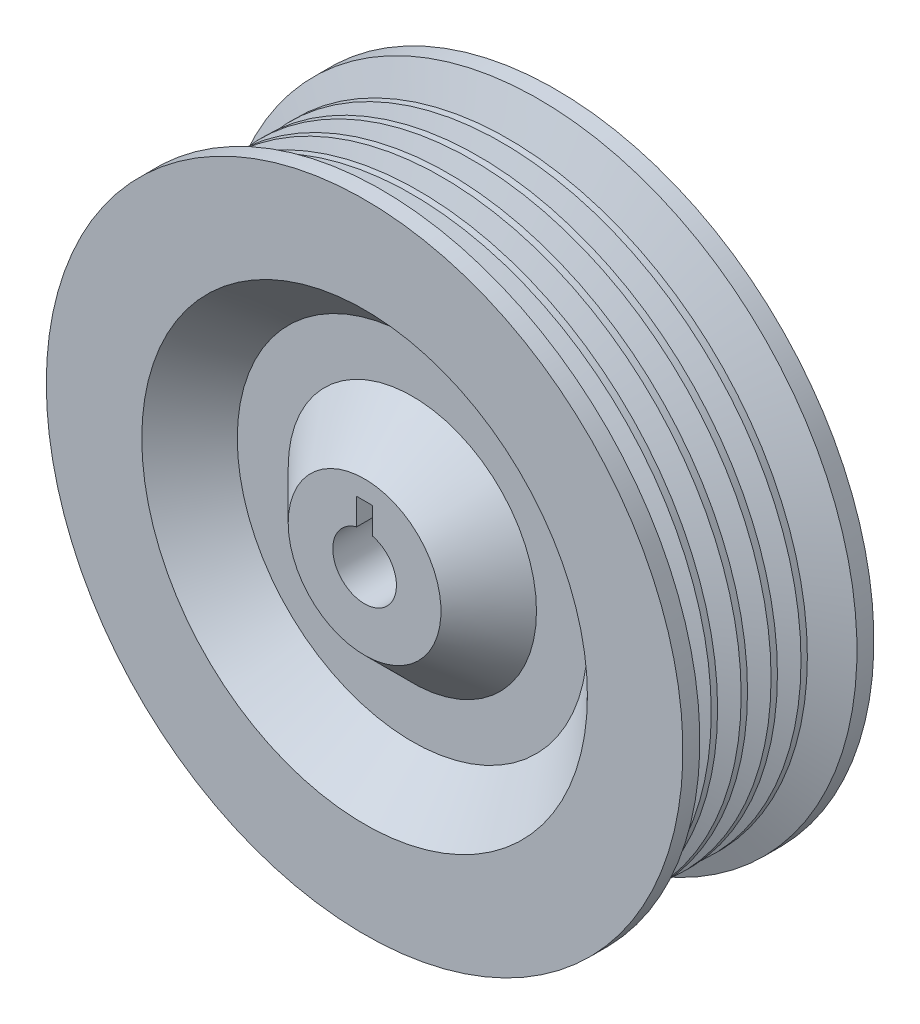
ISO-10303-21;
HEADER;
FILE_DESCRIPTION(('STEP AP214'),'2;1');
FILE_NAME('part.step','',(''),(''),'','','');
FILE_SCHEMA(('AUTOMOTIVE_DESIGN { 1 0 10303 214 1 1 1 1 }'));
ENDSEC;
DATA;
#1=APPLICATION_CONTEXT('core data for automotive mechanical design processes');
#2=APPLICATION_PROTOCOL_DEFINITION('international standard','automotive_design',2000,#1);
#3=PRODUCT_CONTEXT('',#1,'mechanical');
#4=PRODUCT('Part','Part','',(#3));
#5=PRODUCT_RELATED_PRODUCT_CATEGORY('part','',(#4));
#6=PRODUCT_DEFINITION_FORMATION('','',#4);
#7=PRODUCT_DEFINITION_CONTEXT('part definition',#1,'design');
#8=PRODUCT_DEFINITION('design','',#6,#7);
#9=PRODUCT_DEFINITION_SHAPE('','',#8);
#10=(LENGTH_UNIT() NAMED_UNIT(*) SI_UNIT(.MILLI.,.METRE.));
#11=(NAMED_UNIT(*) PLANE_ANGLE_UNIT() SI_UNIT($,.RADIAN.));
#12=(NAMED_UNIT(*) SI_UNIT($,.STERADIAN.) SOLID_ANGLE_UNIT());
#13=UNCERTAINTY_MEASURE_WITH_UNIT(LENGTH_MEASURE(1.E-05),#10,'distance_accuracy_value','');
#14=(GEOMETRIC_REPRESENTATION_CONTEXT(3) GLOBAL_UNCERTAINTY_ASSIGNED_CONTEXT((#13)) GLOBAL_UNIT_ASSIGNED_CONTEXT((#10,
#11,#12)) REPRESENTATION_CONTEXT('',''));
#15=CARTESIAN_POINT('',(0.,0.,0.));
#16=DIRECTION('',(0.,0.,1.));
#17=DIRECTION('',(1.,0.,0.));
#18=AXIS2_PLACEMENT_3D('',#15,#16,#17);
#19=CARTESIAN_POINT('',(0.,0.,0.));
#20=DIRECTION('',(0.,0.,1.));
#21=DIRECTION('',(1.,0.,0.));
#22=AXIS2_PLACEMENT_3D('',#19,#20,#21);
#23=PLANE('',#22);
#24=CARTESIAN_POINT('',(0.,0.,0.));
#25=DIRECTION('',(0.,0.,-1.));
#26=DIRECTION('',(-1.,0.,0.));
#27=AXIS2_PLACEMENT_3D('',#24,#25,#26);
#28=CIRCLE('',#27,5.);
#29=CARTESIAN_POINT('',(1.25,4.84122918275927,0.));
#30=VERTEX_POINT('',#29);
#31=CARTESIAN_POINT('',(-1.25,4.84122918275927,0.));
#32=VERTEX_POINT('',#31);
#33=EDGE_CURVE('E94',#30,#32,#28,.T.);
#34=ORIENTED_EDGE('',*,*,#33,.T.);
#35=DIRECTION('',(0.,-1.,0.));
#36=VECTOR('',#35,1.);
#37=CARTESIAN_POINT('',(-1.25,0.,0.));
#38=LINE('',#37,#36);
#39=CARTESIAN_POINT('',(-1.25,9.,0.));
#40=VERTEX_POINT('',#39);
#41=EDGE_CURVE('E85',#40,#32,#38,.T.);
#42=ORIENTED_EDGE('',*,*,#41,.F.);
#43=DIRECTION('',(-1.,0.,0.));
#44=VECTOR('',#43,1.);
#45=CARTESIAN_POINT('',(0.,9.,0.));
#46=LINE('',#45,#44);
#47=CARTESIAN_POINT('',(1.25,9.,0.));
#48=VERTEX_POINT('',#47);
#49=EDGE_CURVE('E93',#48,#40,#46,.T.);
#50=ORIENTED_EDGE('',*,*,#49,.F.);
#51=DIRECTION('',(0.,1.,0.));
#52=VECTOR('',#51,1.);
#53=CARTESIAN_POINT('',(1.25,0.,0.));
#54=LINE('',#53,#52);
#55=EDGE_CURVE('E100',#30,#48,#54,.T.);
#56=ORIENTED_EDGE('',*,*,#55,.F.);
#57=EDGE_LOOP('',(#34,#42,#50,#56));
#58=FACE_BOUND('',#57,.T.);
#59=CARTESIAN_POINT('',(0.,0.,0.));
#60=DIRECTION('',(0.,0.,-1.));
#61=DIRECTION('',(-1.,0.,0.));
#62=AXIS2_PLACEMENT_3D('',#59,#60,#61);
#63=CIRCLE('',#62,12.);
#64=CARTESIAN_POINT('',(-12.,0.,0.));
#65=VERTEX_POINT('',#64);
#66=EDGE_CURVE('E11',#65,#65,#63,.T.);
#67=ORIENTED_EDGE('',*,*,#66,.F.);
#68=EDGE_LOOP('',(#67));
#69=FACE_BOUND('',#68,.T.);
#70=ADVANCED_FACE('F45',(#58,#69),#23,.T.);
#71=CARTESIAN_POINT('',(0.,0.,-7.4999999999997));
#72=DIRECTION('',(0.,0.,-1.));
#73=DIRECTION('',(-1.,0.,0.));
#74=AXIS2_PLACEMENT_3D('',#71,#72,#73);
#75=CONICAL_SURFACE('',#74,19.4999999999997,0.785398163397446);
#76=ORIENTED_EDGE('',*,*,#66,.T.);
#77=EDGE_LOOP('',(#76));
#78=FACE_BOUND('',#77,.T.);
#79=CARTESIAN_POINT('',(0.,0.,-7.4999999999997));
#80=DIRECTION('',(0.,0.,-1.));
#81=DIRECTION('',(-1.,0.,0.));
#82=AXIS2_PLACEMENT_3D('',#79,#80,#81);
#83=CIRCLE('',#82,19.4999999999997);
#84=CARTESIAN_POINT('',(-19.4999999999997,0.,-7.4999999999997));
#85=VERTEX_POINT('',#84);
#86=EDGE_CURVE('E53',#85,#85,#83,.T.);
#87=ORIENTED_EDGE('',*,*,#86,.F.);
#88=EDGE_LOOP('',(#87));
#89=FACE_BOUND('',#88,.T.);
#90=ADVANCED_FACE('F249',(#78,#89),#75,.T.);
#91=CARTESIAN_POINT('',(0.,19.4999999999997,-7.49999999999985));
#92=DIRECTION('',(0.,0.,1.));
#93=DIRECTION('',(1.,0.,0.));
#94=AXIS2_PLACEMENT_3D('',#91,#92,#93);
#95=PLANE('',#94);
#96=ORIENTED_EDGE('',*,*,#86,.T.);
#97=EDGE_LOOP('',(#96));
#98=FACE_BOUND('',#97,.T.);
#99=CARTESIAN_POINT('',(0.,0.,-7.5));
#100=DIRECTION('',(0.,0.,-1.));
#101=DIRECTION('',(-1.,0.,0.));
#102=AXIS2_PLACEMENT_3D('',#99,#100,#101);
#103=CIRCLE('',#102,27.4999999999996);
#104=CARTESIAN_POINT('',(-27.4999999999996,0.,-7.5));
#105=VERTEX_POINT('',#104);
#106=EDGE_CURVE('E239',#105,#105,#103,.T.);
#107=ORIENTED_EDGE('',*,*,#106,.F.);
#108=EDGE_LOOP('',(#107));
#109=FACE_BOUND('',#108,.T.);
#110=ADVANCED_FACE('F246',(#98,#109),#95,.T.);
#111=CARTESIAN_POINT('',(0.,0.,0.));
#112=DIRECTION('',(0.,0.,1.));
#113=DIRECTION('',(1.,0.,0.));
#114=AXIS2_PLACEMENT_3D('',#111,#112,#113);
#115=CONICAL_SURFACE('',#114,35.,0.785398163397474);
#116=ORIENTED_EDGE('',*,*,#106,.T.);
#117=EDGE_LOOP('',(#116));
#118=FACE_BOUND('',#117,.T.);
#119=CARTESIAN_POINT('',(0.,0.,0.));
#120=DIRECTION('',(0.,0.,-1.));
#121=DIRECTION('',(-1.,0.,0.));
#122=AXIS2_PLACEMENT_3D('',#119,#120,#121);
#123=CIRCLE('',#122,35.);
#124=CARTESIAN_POINT('',(-35.,0.,0.));
#125=VERTEX_POINT('',#124);
#126=EDGE_CURVE('E235',#125,#125,#123,.T.);
#127=ORIENTED_EDGE('',*,*,#126,.F.);
#128=EDGE_LOOP('',(#127));
#129=FACE_BOUND('',#128,.T.);
#130=ADVANCED_FACE('F255',(#118,#129),#115,.F.);
#131=CARTESIAN_POINT('',(0.,35.,0.));
#132=DIRECTION('',(0.,0.,1.));
#133=DIRECTION('',(1.,0.,0.));
#134=AXIS2_PLACEMENT_3D('',#131,#132,#133);
#135=PLANE('',#134);
#136=ORIENTED_EDGE('',*,*,#126,.T.);
#137=EDGE_LOOP('',(#136));
#138=FACE_BOUND('',#137,.T.);
#139=CARTESIAN_POINT('',(0.,0.,0.));
#140=DIRECTION('',(0.,0.,-1.));
#141=DIRECTION('',(-1.,0.,0.));
#142=AXIS2_PLACEMENT_3D('',#139,#140,#141);
#143=CIRCLE('',#142,50.);
#144=CARTESIAN_POINT('',(-50.,0.,0.));
#145=VERTEX_POINT('',#144);
#146=EDGE_CURVE('E231',#145,#145,#143,.T.);
#147=ORIENTED_EDGE('',*,*,#146,.F.);
#148=EDGE_LOOP('',(#147));
#149=FACE_BOUND('',#148,.T.);
#150=ADVANCED_FACE('F261',(#138,#149),#135,.T.);
#151=CARTESIAN_POINT('',(0.,0.,-30.));
#152=DIRECTION('',(0.,0.,-1.));
#153=DIRECTION('',(-1.,0.,0.));
#154=AXIS2_PLACEMENT_3D('',#151,#152,#153);
#155=CYLINDRICAL_SURFACE('',#154,49.9999999999999);
#156=ORIENTED_EDGE('',*,*,#146,.T.);
#157=EDGE_LOOP('',(#156));
#158=FACE_BOUND('',#157,.T.);
#159=CARTESIAN_POINT('',(0.,0.,-2.6580892972007));
#160=DIRECTION('',(0.,0.,-1.));
#161=DIRECTION('',(-1.,0.,0.));
#162=AXIS2_PLACEMENT_3D('',#159,#160,#161);
#163=CIRCLE('',#162,49.9999999999999);
#164=CARTESIAN_POINT('',(-49.9999999999999,0.,-2.6580892972007));
#165=VERTEX_POINT('',#164);
#166=EDGE_CURVE('E227',#165,#165,#163,.T.);
#167=ORIENTED_EDGE('',*,*,#166,.F.);
#168=EDGE_LOOP('',(#167));
#169=FACE_BOUND('',#168,.T.);
#170=ADVANCED_FACE('F265',(#158,#169),#155,.T.);
#171=CARTESIAN_POINT('',(0.,0.,-5.29929836134751));
#172=DIRECTION('',(0.,0.,1.));
#173=DIRECTION('',(1.,0.,0.));
#174=AXIS2_PLACEMENT_3D('',#171,#172,#173);
#175=CONICAL_SURFACE('',#174,42.7433377361957,1.22173047639612);
#176=ORIENTED_EDGE('',*,*,#166,.T.);
#177=EDGE_LOOP('',(#176));
#178=FACE_BOUND('',#177,.T.);
#179=CARTESIAN_POINT('',(0.,0.,-5.29929836134751));
#180=DIRECTION('',(0.,0.,-1.));
#181=DIRECTION('',(-1.,0.,0.));
#182=AXIS2_PLACEMENT_3D('',#179,#180,#181);
#183=CIRCLE('',#182,42.7433377361957);
#184=CARTESIAN_POINT('',(-42.7433377361957,0.,-5.29929836134751));
#185=VERTEX_POINT('',#184);
#186=EDGE_CURVE('E223',#185,#185,#183,.T.);
#187=ORIENTED_EDGE('',*,*,#186,.F.);
#188=EDGE_LOOP('',(#187));
#189=FACE_BOUND('',#188,.T.);
#190=ADVANCED_FACE('F269',(#178,#189),#175,.T.);
#191=CARTESIAN_POINT('',(0.,0.,-5.59999999999901));
#192=DIRECTION('',(0.,0.,-1.));
#193=DIRECTION('',(-1.,0.,0.));
#194=AXIS2_PLACEMENT_3D('',#191,#192,#193);
#195=TOROIDAL_SURFACE('',#194,42.8527841820601,0.32000000000008);
#196=ORIENTED_EDGE('',*,*,#186,.T.);
#197=EDGE_LOOP('',(#196));
#198=FACE_BOUND('',#197,.T.);
#199=CARTESIAN_POINT('',(0.,0.,-5.90070163865051));
#200=DIRECTION('',(0.,0.,-1.));
#201=DIRECTION('',(-1.,0.,0.));
#202=AXIS2_PLACEMENT_3D('',#199,#200,#201);
#203=CIRCLE('',#202,42.7433377361957);
#204=CARTESIAN_POINT('',(-42.7433377361957,0.,-5.90070163865051));
#205=VERTEX_POINT('',#204);
#206=EDGE_CURVE('E219',#205,#205,#203,.T.);
#207=ORIENTED_EDGE('',*,*,#206,.F.);
#208=EDGE_LOOP('',(#207));
#209=FACE_BOUND('',#208,.T.);
#210=ADVANCED_FACE('F273',(#198,#209),#195,.F.);
#211=CARTESIAN_POINT('',(0.,0.,-7.44999999999901));
#212=DIRECTION('',(0.,0.,-1.));
#213=DIRECTION('',(-1.,0.,0.));
#214=AXIS2_PLACEMENT_3D('',#211,#212,#213);
#215=CONICAL_SURFACE('',#214,46.9999999999999,1.22173047639612);
#216=ORIENTED_EDGE('',*,*,#206,.T.);
#217=EDGE_LOOP('',(#216));
#218=FACE_BOUND('',#217,.T.);
#219=CARTESIAN_POINT('',(0.,0.,-7.44999999999901));
#220=DIRECTION('',(0.,0.,-1.));
#221=DIRECTION('',(-1.,0.,0.));
#222=AXIS2_PLACEMENT_3D('',#219,#220,#221);
#223=CIRCLE('',#222,46.9999999999999);
#224=CARTESIAN_POINT('',(-46.9999999999999,0.,-7.44999999999901));
#225=VERTEX_POINT('',#224);
#226=EDGE_CURVE('E215',#225,#225,#223,.T.);
#227=ORIENTED_EDGE('',*,*,#226,.F.);
#228=EDGE_LOOP('',(#227));
#229=FACE_BOUND('',#228,.T.);
#230=ADVANCED_FACE('F277',(#218,#229),#215,.T.);
#231=CARTESIAN_POINT('',(0.,0.,-30.));
#232=DIRECTION('',(0.,0.,-1.));
#233=DIRECTION('',(-1.,0.,0.));
#234=AXIS2_PLACEMENT_3D('',#231,#232,#233);
#235=CYLINDRICAL_SURFACE('',#234,46.9999999999999);
#236=ORIENTED_EDGE('',*,*,#226,.T.);
#237=EDGE_LOOP('',(#236));
#238=FACE_BOUND('',#237,.T.);
#239=CARTESIAN_POINT('',(0.,0.,-8.44999999999901));
#240=DIRECTION('',(0.,0.,-1.));
#241=DIRECTION('',(-1.,0.,0.));
#242=AXIS2_PLACEMENT_3D('',#239,#240,#241);
#243=CIRCLE('',#242,46.9999999999999);
#244=CARTESIAN_POINT('',(-46.9999999999999,0.,-8.44999999999901));
#245=VERTEX_POINT('',#244);
#246=EDGE_CURVE('E211',#245,#245,#243,.T.);
#247=ORIENTED_EDGE('',*,*,#246,.F.);
#248=EDGE_LOOP('',(#247));
#249=FACE_BOUND('',#248,.T.);
#250=ADVANCED_FACE('F281',(#238,#249),#235,.T.);
#251=CARTESIAN_POINT('',(0.,0.,-9.99929836134751));
#252=DIRECTION('',(0.,0.,1.));
#253=DIRECTION('',(1.,0.,0.));
#254=AXIS2_PLACEMENT_3D('',#251,#252,#253);
#255=CONICAL_SURFACE('',#254,42.7433377361957,1.22173047639612);
#256=ORIENTED_EDGE('',*,*,#246,.T.);
#257=EDGE_LOOP('',(#256));
#258=FACE_BOUND('',#257,.T.);
#259=CARTESIAN_POINT('',(0.,0.,-9.99929836134751));
#260=DIRECTION('',(0.,0.,-1.));
#261=DIRECTION('',(-1.,0.,0.));
#262=AXIS2_PLACEMENT_3D('',#259,#260,#261);
#263=CIRCLE('',#262,42.7433377361957);
#264=CARTESIAN_POINT('',(-42.7433377361957,0.,-9.99929836134751));
#265=VERTEX_POINT('',#264);
#266=EDGE_CURVE('E207',#265,#265,#263,.T.);
#267=ORIENTED_EDGE('',*,*,#266,.F.);
#268=EDGE_LOOP('',(#267));
#269=FACE_BOUND('',#268,.T.);
#270=ADVANCED_FACE('F285',(#258,#269),#255,.T.);
#271=CARTESIAN_POINT('',(0.,0.,-10.299999999999));
#272=DIRECTION('',(0.,0.,-1.));
#273=DIRECTION('',(-1.,0.,0.));
#274=AXIS2_PLACEMENT_3D('',#271,#272,#273);
#275=TOROIDAL_SURFACE('',#274,42.85278418206,0.320000000000068);
#276=ORIENTED_EDGE('',*,*,#266,.T.);
#277=EDGE_LOOP('',(#276));
#278=FACE_BOUND('',#277,.T.);
#279=CARTESIAN_POINT('',(0.,0.,-10.6007016386505));
#280=DIRECTION('',(0.,0.,-1.));
#281=DIRECTION('',(-1.,0.,0.));
#282=AXIS2_PLACEMENT_3D('',#279,#280,#281);
#283=CIRCLE('',#282,42.7433377361957);
#284=CARTESIAN_POINT('',(-42.7433377361957,0.,-10.6007016386505));
#285=VERTEX_POINT('',#284);
#286=EDGE_CURVE('E203',#285,#285,#283,.T.);
#287=ORIENTED_EDGE('',*,*,#286,.F.);
#288=EDGE_LOOP('',(#287));
#289=FACE_BOUND('',#288,.T.);
#290=ADVANCED_FACE('F289',(#278,#289),#275,.F.);
#291=CARTESIAN_POINT('',(0.,0.,-12.149999999999));
#292=DIRECTION('',(0.,0.,-1.));
#293=DIRECTION('',(-1.,0.,0.));
#294=AXIS2_PLACEMENT_3D('',#291,#292,#293);
#295=CONICAL_SURFACE('',#294,46.9999999999999,1.22173047639612);
#296=ORIENTED_EDGE('',*,*,#286,.T.);
#297=EDGE_LOOP('',(#296));
#298=FACE_BOUND('',#297,.T.);
#299=CARTESIAN_POINT('',(0.,0.,-12.149999999999));
#300=DIRECTION('',(0.,0.,-1.));
#301=DIRECTION('',(-1.,0.,0.));
#302=AXIS2_PLACEMENT_3D('',#299,#300,#301);
#303=CIRCLE('',#302,46.9999999999999);
#304=CARTESIAN_POINT('',(-46.9999999999999,0.,-12.149999999999));
#305=VERTEX_POINT('',#304);
#306=EDGE_CURVE('E199',#305,#305,#303,.T.);
#307=ORIENTED_EDGE('',*,*,#306,.F.);
#308=EDGE_LOOP('',(#307));
#309=FACE_BOUND('',#308,.T.);
#310=ADVANCED_FACE('F293',(#298,#309),#295,.T.);
#311=CARTESIAN_POINT('',(0.,0.,-30.));
#312=DIRECTION('',(0.,0.,-1.));
#313=DIRECTION('',(-1.,0.,0.));
#314=AXIS2_PLACEMENT_3D('',#311,#312,#313);
#315=CYLINDRICAL_SURFACE('',#314,46.9999999999999);
#316=ORIENTED_EDGE('',*,*,#306,.T.);
#317=EDGE_LOOP('',(#316));
#318=FACE_BOUND('',#317,.T.);
#319=CARTESIAN_POINT('',(0.,0.,-13.149999999999));
#320=DIRECTION('',(0.,0.,-1.));
#321=DIRECTION('',(-1.,0.,0.));
#322=AXIS2_PLACEMENT_3D('',#319,#320,#321);
#323=CIRCLE('',#322,46.9999999999999);
#324=CARTESIAN_POINT('',(-46.9999999999999,0.,-13.149999999999));
#325=VERTEX_POINT('',#324);
#326=EDGE_CURVE('E195',#325,#325,#323,.T.);
#327=ORIENTED_EDGE('',*,*,#326,.F.);
#328=EDGE_LOOP('',(#327));
#329=FACE_BOUND('',#328,.T.);
#330=ADVANCED_FACE('F297',(#318,#329),#315,.T.);
#331=CARTESIAN_POINT('',(0.,0.,-14.6992983613485));
#332=DIRECTION('',(0.,0.,1.));
#333=DIRECTION('',(1.,0.,0.));
#334=AXIS2_PLACEMENT_3D('',#331,#332,#333);
#335=CONICAL_SURFACE('',#334,42.743337736196,1.22173047639588);
#336=ORIENTED_EDGE('',*,*,#326,.T.);
#337=EDGE_LOOP('',(#336));
#338=FACE_BOUND('',#337,.T.);
#339=CARTESIAN_POINT('',(0.,0.,-14.6992983613485));
#340=DIRECTION('',(0.,0.,-1.));
#341=DIRECTION('',(-1.,0.,0.));
#342=AXIS2_PLACEMENT_3D('',#339,#340,#341);
#343=CIRCLE('',#342,42.743337736196);
#344=CARTESIAN_POINT('',(-42.743337736196,0.,-14.6992983613485));
#345=VERTEX_POINT('',#344);
#346=EDGE_CURVE('E191',#345,#345,#343,.T.);
#347=ORIENTED_EDGE('',*,*,#346,.F.);
#348=EDGE_LOOP('',(#347));
#349=FACE_BOUND('',#348,.T.);
#350=ADVANCED_FACE('F301',(#338,#349),#335,.T.);
#351=CARTESIAN_POINT('',(0.,0.,-15.));
#352=DIRECTION('',(0.,0.,-1.));
#353=DIRECTION('',(-1.,0.,0.));
#354=AXIS2_PLACEMENT_3D('',#351,#352,#353);
#355=TOROIDAL_SURFACE('',#354,42.8527841820603,0.320000000000001);
#356=ORIENTED_EDGE('',*,*,#346,.T.);
#357=EDGE_LOOP('',(#356));
#358=FACE_BOUND('',#357,.T.);
#359=CARTESIAN_POINT('',(0.,0.,-15.3007016386516));
#360=DIRECTION('',(0.,0.,-1.));
#361=DIRECTION('',(-1.,0.,0.));
#362=AXIS2_PLACEMENT_3D('',#359,#360,#361);
#363=CIRCLE('',#362,42.7433377361963);
#364=CARTESIAN_POINT('',(-42.7433377361963,0.,-15.3007016386516));
#365=VERTEX_POINT('',#364);
#366=EDGE_CURVE('E187',#365,#365,#363,.T.);
#367=ORIENTED_EDGE('',*,*,#366,.F.);
#368=EDGE_LOOP('',(#367));
#369=FACE_BOUND('',#368,.T.);
#370=ADVANCED_FACE('F305',(#358,#369),#355,.F.);
#371=CARTESIAN_POINT('',(0.,0.,-16.8500000000001));
#372=DIRECTION('',(0.,0.,-1.));
#373=DIRECTION('',(-1.,0.,0.));
#374=AXIS2_PLACEMENT_3D('',#371,#372,#373);
#375=CONICAL_SURFACE('',#374,47.0000000000005,1.22173047639612);
#376=ORIENTED_EDGE('',*,*,#366,.T.);
#377=EDGE_LOOP('',(#376));
#378=FACE_BOUND('',#377,.T.);
#379=CARTESIAN_POINT('',(0.,0.,-16.8500000000001));
#380=DIRECTION('',(0.,0.,-1.));
#381=DIRECTION('',(-1.,0.,0.));
#382=AXIS2_PLACEMENT_3D('',#379,#380,#381);
#383=CIRCLE('',#382,47.0000000000005);
#384=CARTESIAN_POINT('',(-47.0000000000005,0.,-16.8500000000001));
#385=VERTEX_POINT('',#384);
#386=EDGE_CURVE('E183',#385,#385,#383,.T.);
#387=ORIENTED_EDGE('',*,*,#386,.F.);
#388=EDGE_LOOP('',(#387));
#389=FACE_BOUND('',#388,.T.);
#390=ADVANCED_FACE('F309',(#378,#389),#375,.T.);
#391=CARTESIAN_POINT('',(0.,0.,-30.));
#392=DIRECTION('',(0.,0.,-1.));
#393=DIRECTION('',(-1.,0.,0.));
#394=AXIS2_PLACEMENT_3D('',#391,#392,#393);
#395=CYLINDRICAL_SURFACE('',#394,47.0000000000006);
#396=ORIENTED_EDGE('',*,*,#386,.T.);
#397=EDGE_LOOP('',(#396));
#398=FACE_BOUND('',#397,.T.);
#399=CARTESIAN_POINT('',(0.,0.,-17.8500000000001));
#400=DIRECTION('',(0.,0.,-1.));
#401=DIRECTION('',(-1.,0.,0.));
#402=AXIS2_PLACEMENT_3D('',#399,#400,#401);
#403=CIRCLE('',#402,47.0000000000007);
#404=CARTESIAN_POINT('',(-47.0000000000007,0.,-17.8500000000001));
#405=VERTEX_POINT('',#404);
#406=EDGE_CURVE('E179',#405,#405,#403,.T.);
#407=ORIENTED_EDGE('',*,*,#406,.F.);
#408=EDGE_LOOP('',(#407));
#409=FACE_BOUND('',#408,.T.);
#410=ADVANCED_FACE('F313',(#398,#409),#395,.T.);
#411=CARTESIAN_POINT('',(0.,0.,-19.3992983613493));
#412=DIRECTION('',(0.,0.,1.));
#413=DIRECTION('',(1.,0.,0.));
#414=AXIS2_PLACEMENT_3D('',#411,#412,#413);
#415=CONICAL_SURFACE('',#414,42.7433377361968,1.22173047639594);
#416=ORIENTED_EDGE('',*,*,#406,.T.);
#417=EDGE_LOOP('',(#416));
#418=FACE_BOUND('',#417,.T.);
#419=CARTESIAN_POINT('',(0.,0.,-19.3992983613493));
#420=DIRECTION('',(0.,0.,-1.));
#421=DIRECTION('',(-1.,0.,0.));
#422=AXIS2_PLACEMENT_3D('',#419,#420,#421);
#423=CIRCLE('',#422,42.7433377361968);
#424=CARTESIAN_POINT('',(-42.7433377361968,0.,-19.3992983613493));
#425=VERTEX_POINT('',#424);
#426=EDGE_CURVE('E175',#425,#425,#423,.T.);
#427=ORIENTED_EDGE('',*,*,#426,.F.);
#428=EDGE_LOOP('',(#427));
#429=FACE_BOUND('',#428,.T.);
#430=ADVANCED_FACE('F317',(#418,#429),#415,.T.);
#431=CARTESIAN_POINT('',(0.,0.,-19.7000000000007));
#432=DIRECTION('',(0.,0.,-1.));
#433=DIRECTION('',(-1.,0.,0.));
#434=AXIS2_PLACEMENT_3D('',#431,#432,#433);
#435=TOROIDAL_SURFACE('',#434,42.8527841820608,0.319999999999941);
#436=ORIENTED_EDGE('',*,*,#426,.T.);
#437=EDGE_LOOP('',(#436));
#438=FACE_BOUND('',#437,.T.);
#439=CARTESIAN_POINT('',(0.,0.,-20.0007016386522));
#440=DIRECTION('',(0.,0.,-1.));
#441=DIRECTION('',(-1.,0.,0.));
#442=AXIS2_PLACEMENT_3D('',#439,#440,#441);
#443=CIRCLE('',#442,42.7433377361968);
#444=CARTESIAN_POINT('',(-42.7433377361968,0.,-20.0007016386522));
#445=VERTEX_POINT('',#444);
#446=EDGE_CURVE('E171',#445,#445,#443,.T.);
#447=ORIENTED_EDGE('',*,*,#446,.F.);
#448=EDGE_LOOP('',(#447));
#449=FACE_BOUND('',#448,.T.);
#450=ADVANCED_FACE('F321',(#438,#449),#435,.F.);
#451=CARTESIAN_POINT('',(0.,0.,-21.5500000000008));
#452=DIRECTION('',(0.,0.,-1.));
#453=DIRECTION('',(-1.,0.,0.));
#454=AXIS2_PLACEMENT_3D('',#451,#452,#453);
#455=CONICAL_SURFACE('',#454,47.000000000001,1.22173047639609);
#456=ORIENTED_EDGE('',*,*,#446,.T.);
#457=EDGE_LOOP('',(#456));
#458=FACE_BOUND('',#457,.T.);
#459=CARTESIAN_POINT('',(0.,0.,-21.5500000000008));
#460=DIRECTION('',(0.,0.,-1.));
#461=DIRECTION('',(-1.,0.,0.));
#462=AXIS2_PLACEMENT_3D('',#459,#460,#461);
#463=CIRCLE('',#462,47.000000000001);
#464=CARTESIAN_POINT('',(-47.000000000001,0.,-21.5500000000008));
#465=VERTEX_POINT('',#464);
#466=EDGE_CURVE('E167',#465,#465,#463,.T.);
#467=ORIENTED_EDGE('',*,*,#466,.F.);
#468=EDGE_LOOP('',(#467));
#469=FACE_BOUND('',#468,.T.);
#470=ADVANCED_FACE('F325',(#458,#469),#455,.T.);
#471=CARTESIAN_POINT('',(0.,0.,-30.));
#472=DIRECTION('',(0.,0.,-1.));
#473=DIRECTION('',(-1.,0.,0.));
#474=AXIS2_PLACEMENT_3D('',#471,#472,#473);
#475=CYLINDRICAL_SURFACE('',#474,47.000000000001);
#476=ORIENTED_EDGE('',*,*,#466,.T.);
#477=EDGE_LOOP('',(#476));
#478=FACE_BOUND('',#477,.T.);
#479=CARTESIAN_POINT('',(0.,0.,-22.5500000000008));
#480=DIRECTION('',(0.,0.,-1.));
#481=DIRECTION('',(-1.,0.,0.));
#482=AXIS2_PLACEMENT_3D('',#479,#480,#481);
#483=CIRCLE('',#482,47.0000000000011);
#484=CARTESIAN_POINT('',(-47.0000000000011,0.,-22.5500000000008));
#485=VERTEX_POINT('',#484);
#486=EDGE_CURVE('E163',#485,#485,#483,.T.);
#487=ORIENTED_EDGE('',*,*,#486,.F.);
#488=EDGE_LOOP('',(#487));
#489=FACE_BOUND('',#488,.T.);
#490=ADVANCED_FACE('F329',(#478,#489),#475,.T.);
#491=CARTESIAN_POINT('',(0.,0.,-24.0992983613501));
#492=DIRECTION('',(0.,0.,1.));
#493=DIRECTION('',(1.,0.,0.));
#494=AXIS2_PLACEMENT_3D('',#491,#492,#493);
#495=CONICAL_SURFACE('',#494,42.7433377361972,1.22173047639594);
#496=ORIENTED_EDGE('',*,*,#486,.T.);
#497=EDGE_LOOP('',(#496));
#498=FACE_BOUND('',#497,.T.);
#499=CARTESIAN_POINT('',(0.,0.,-24.0992983613501));
#500=DIRECTION('',(0.,0.,-1.));
#501=DIRECTION('',(-1.,0.,0.));
#502=AXIS2_PLACEMENT_3D('',#499,#500,#501);
#503=CIRCLE('',#502,42.7433377361972);
#504=CARTESIAN_POINT('',(-42.7433377361972,0.,-24.0992983613501));
#505=VERTEX_POINT('',#504);
#506=EDGE_CURVE('E159',#505,#505,#503,.T.);
#507=ORIENTED_EDGE('',*,*,#506,.F.);
#508=EDGE_LOOP('',(#507));
#509=FACE_BOUND('',#508,.T.);
#510=ADVANCED_FACE('F333',(#498,#509),#495,.T.);
#511=CARTESIAN_POINT('',(0.,0.,-24.4000000000014));
#512=DIRECTION('',(0.,0.,-1.));
#513=DIRECTION('',(-1.,0.,0.));
#514=AXIS2_PLACEMENT_3D('',#511,#512,#513);
#515=TOROIDAL_SURFACE('',#514,42.8527841820612,0.319999999999927);
#516=ORIENTED_EDGE('',*,*,#506,.T.);
#517=EDGE_LOOP('',(#516));
#518=FACE_BOUND('',#517,.T.);
#519=CARTESIAN_POINT('',(0.,0.,-24.7007016386529));
#520=DIRECTION('',(0.,0.,-1.));
#521=DIRECTION('',(-1.,0.,0.));
#522=AXIS2_PLACEMENT_3D('',#519,#520,#521);
#523=CIRCLE('',#522,42.7433377361973);
#524=CARTESIAN_POINT('',(-42.7433377361973,0.,-24.7007016386529));
#525=VERTEX_POINT('',#524);
#526=EDGE_CURVE('E155',#525,#525,#523,.T.);
#527=ORIENTED_EDGE('',*,*,#526,.F.);
#528=EDGE_LOOP('',(#527));
#529=FACE_BOUND('',#528,.T.);
#530=ADVANCED_FACE('F337',(#518,#529),#515,.F.);
#531=CARTESIAN_POINT('',(0.,0.,-27.3419107027993));
#532=DIRECTION('',(0.,0.,-1.));
#533=DIRECTION('',(-1.,0.,0.));
#534=AXIS2_PLACEMENT_3D('',#531,#532,#533);
#535=CONICAL_SURFACE('',#534,49.9999999999999,1.2217304763961);
#536=ORIENTED_EDGE('',*,*,#526,.T.);
#537=EDGE_LOOP('',(#536));
#538=FACE_BOUND('',#537,.T.);
#539=CARTESIAN_POINT('',(0.,0.,-27.3419107027993));
#540=DIRECTION('',(0.,0.,-1.));
#541=DIRECTION('',(-1.,0.,0.));
#542=AXIS2_PLACEMENT_3D('',#539,#540,#541);
#543=CIRCLE('',#542,49.9999999999999);
#544=CARTESIAN_POINT('',(-49.9999999999999,0.,-27.3419107027993));
#545=VERTEX_POINT('',#544);
#546=EDGE_CURVE('E151',#545,#545,#543,.T.);
#547=ORIENTED_EDGE('',*,*,#546,.F.);
#548=EDGE_LOOP('',(#547));
#549=FACE_BOUND('',#548,.T.);
#550=ADVANCED_FACE('F341',(#538,#549),#535,.T.);
#551=CARTESIAN_POINT('',(0.,0.,-30.));
#552=DIRECTION('',(0.,0.,-1.));
#553=DIRECTION('',(-1.,0.,0.));
#554=AXIS2_PLACEMENT_3D('',#551,#552,#553);
#555=CYLINDRICAL_SURFACE('',#554,49.9999999999999);
#556=ORIENTED_EDGE('',*,*,#546,.T.);
#557=EDGE_LOOP('',(#556));
#558=FACE_BOUND('',#557,.T.);
#559=CARTESIAN_POINT('',(0.,0.,-30.));
#560=DIRECTION('',(0.,0.,-1.));
#561=DIRECTION('',(-1.,0.,0.));
#562=AXIS2_PLACEMENT_3D('',#559,#560,#561);
#563=CIRCLE('',#562,50.);
#564=CARTESIAN_POINT('',(-50.,0.,-30.));
#565=VERTEX_POINT('',#564);
#566=EDGE_CURVE('E147',#565,#565,#563,.T.);
#567=ORIENTED_EDGE('',*,*,#566,.F.);
#568=EDGE_LOOP('',(#567));
#569=FACE_BOUND('',#568,.T.);
#570=ADVANCED_FACE('F345',(#558,#569),#555,.T.);
#571=CARTESIAN_POINT('',(0.,50.,-30.));
#572=DIRECTION('',(0.,0.,-1.));
#573=DIRECTION('',(-1.,0.,0.));
#574=AXIS2_PLACEMENT_3D('',#571,#572,#573);
#575=PLANE('',#574);
#576=ORIENTED_EDGE('',*,*,#566,.T.);
#577=EDGE_LOOP('',(#576));
#578=FACE_BOUND('',#577,.T.);
#579=CARTESIAN_POINT('',(0.,0.,-30.));
#580=DIRECTION('',(0.,0.,-1.));
#581=DIRECTION('',(-1.,0.,0.));
#582=AXIS2_PLACEMENT_3D('',#579,#580,#581);
#583=CIRCLE('',#582,35.);
#584=CARTESIAN_POINT('',(-35.,0.,-30.));
#585=VERTEX_POINT('',#584);
#586=EDGE_CURVE('E143',#585,#585,#583,.T.);
#587=ORIENTED_EDGE('',*,*,#586,.F.);
#588=EDGE_LOOP('',(#587));
#589=FACE_BOUND('',#588,.T.);
#590=ADVANCED_FACE('F349',(#578,#589),#575,.T.);
#591=CARTESIAN_POINT('',(0.,0.,-22.5));
#592=DIRECTION('',(0.,0.,-1.));
#593=DIRECTION('',(-1.,0.,0.));
#594=AXIS2_PLACEMENT_3D('',#591,#592,#593);
#595=CONICAL_SURFACE('',#594,27.5,0.78539816339745);
#596=ORIENTED_EDGE('',*,*,#586,.T.);
#597=EDGE_LOOP('',(#596));
#598=FACE_BOUND('',#597,.T.);
#599=CARTESIAN_POINT('',(0.,0.,-22.5));
#600=DIRECTION('',(0.,0.,-1.));
#601=DIRECTION('',(-1.,0.,0.));
#602=AXIS2_PLACEMENT_3D('',#599,#600,#601);
#603=CIRCLE('',#602,27.5);
#604=CARTESIAN_POINT('',(-27.5,0.,-22.5));
#605=VERTEX_POINT('',#604);
#606=EDGE_CURVE('E139',#605,#605,#603,.T.);
#607=ORIENTED_EDGE('',*,*,#606,.F.);
#608=EDGE_LOOP('',(#607));
#609=FACE_BOUND('',#608,.T.);
#610=ADVANCED_FACE('F353',(#598,#609),#595,.F.);
#611=CARTESIAN_POINT('',(0.,27.5,-22.5));
#612=DIRECTION('',(0.,0.,-1.));
#613=DIRECTION('',(-1.,0.,0.));
#614=AXIS2_PLACEMENT_3D('',#611,#612,#613);
#615=PLANE('',#614);
#616=ORIENTED_EDGE('',*,*,#606,.T.);
#617=EDGE_LOOP('',(#616));
#618=FACE_BOUND('',#617,.T.);
#619=CARTESIAN_POINT('',(0.,0.,-22.5));
#620=DIRECTION('',(0.,0.,-1.));
#621=DIRECTION('',(-1.,0.,0.));
#622=AXIS2_PLACEMENT_3D('',#619,#620,#621);
#623=CIRCLE('',#622,19.5);
#624=CARTESIAN_POINT('',(-19.5,0.,-22.5));
#625=VERTEX_POINT('',#624);
#626=EDGE_CURVE('E135',#625,#625,#623,.T.);
#627=ORIENTED_EDGE('',*,*,#626,.F.);
#628=EDGE_LOOP('',(#627));
#629=FACE_BOUND('',#628,.T.);
#630=ADVANCED_FACE('F357',(#618,#629),#615,.T.);
#631=CARTESIAN_POINT('',(0.,0.,-30.));
#632=DIRECTION('',(0.,0.,1.));
#633=DIRECTION('',(1.,0.,0.));
#634=AXIS2_PLACEMENT_3D('',#631,#632,#633);
#635=CONICAL_SURFACE('',#634,12.,0.785398163397447);
#636=ORIENTED_EDGE('',*,*,#626,.T.);
#637=EDGE_LOOP('',(#636));
#638=FACE_BOUND('',#637,.T.);
#639=CARTESIAN_POINT('',(0.,0.,-30.));
#640=DIRECTION('',(0.,0.,-1.));
#641=DIRECTION('',(-1.,0.,0.));
#642=AXIS2_PLACEMENT_3D('',#639,#640,#641);
#643=CIRCLE('',#642,12.);
#644=CARTESIAN_POINT('',(-12.,0.,-30.));
#645=VERTEX_POINT('',#644);
#646=EDGE_CURVE('E126',#645,#645,#643,.T.);
#647=ORIENTED_EDGE('',*,*,#646,.F.);
#648=EDGE_LOOP('',(#647));
#649=FACE_BOUND('',#648,.T.);
#650=ADVANCED_FACE('F361',(#638,#649),#635,.T.);
#651=CARTESIAN_POINT('',(0.,12.,-30.));
#652=DIRECTION('',(0.,0.,-1.));
#653=DIRECTION('',(-1.,0.,0.));
#654=AXIS2_PLACEMENT_3D('',#651,#652,#653);
#655=PLANE('',#654);
#656=CARTESIAN_POINT('',(0.,0.,-30.));
#657=DIRECTION('',(0.,0.,-1.));
#658=DIRECTION('',(-1.,0.,0.));
#659=AXIS2_PLACEMENT_3D('',#656,#657,#658);
#660=CIRCLE('',#659,5.);
#661=CARTESIAN_POINT('',(1.25,4.84122918275927,-30.));
#662=VERTEX_POINT('',#661);
#663=CARTESIAN_POINT('',(-1.25,4.84122918275927,-30.));
#664=VERTEX_POINT('',#663);
#665=EDGE_CURVE('E68',#662,#664,#660,.T.);
#666=ORIENTED_EDGE('',*,*,#665,.F.);
#667=DIRECTION('',(0.,1.,0.));
#668=VECTOR('',#667,1.);
#669=CARTESIAN_POINT('',(1.25,0.,-30.));
#670=LINE('',#669,#668);
#671=CARTESIAN_POINT('',(1.25,9.,-30.));
#672=VERTEX_POINT('',#671);
#673=EDGE_CURVE('E104',#662,#672,#670,.T.);
#674=ORIENTED_EDGE('',*,*,#673,.T.);
#675=DIRECTION('',(-1.,0.,0.));
#676=VECTOR('',#675,1.);
#677=CARTESIAN_POINT('',(0.,9.,-30.));
#678=LINE('',#677,#676);
#679=CARTESIAN_POINT('',(-1.25,9.,-30.));
#680=VERTEX_POINT('',#679);
#681=EDGE_CURVE('E108',#672,#680,#678,.T.);
#682=ORIENTED_EDGE('',*,*,#681,.T.);
#683=DIRECTION('',(0.,-1.,0.));
#684=VECTOR('',#683,1.);
#685=CARTESIAN_POINT('',(-1.25,0.,-30.));
#686=LINE('',#685,#684);
#687=EDGE_CURVE('E117',#680,#664,#686,.T.);
#688=ORIENTED_EDGE('',*,*,#687,.T.);
#689=EDGE_LOOP('',(#666,#674,#682,#688));
#690=FACE_BOUND('',#689,.T.);
#691=ORIENTED_EDGE('',*,*,#646,.T.);
#692=EDGE_LOOP('',(#691));
#693=FACE_BOUND('',#692,.T.);
#694=ADVANCED_FACE('F365',(#690,#693),#655,.T.);
#695=CARTESIAN_POINT('',(0.,0.,0.));
#696=DIRECTION('',(0.,0.,-1.));
#697=DIRECTION('',(0.,1.,0.));
#698=AXIS2_PLACEMENT_3D('',#695,#696,#697);
#699=CYLINDRICAL_SURFACE('',#698,5.);
#700=ORIENTED_EDGE('',*,*,#665,.T.);
#701=DIRECTION('',(0.,0.,-1.));
#702=VECTOR('',#701,1.);
#703=CARTESIAN_POINT('',(-1.25,4.84122918275927,0.));
#704=LINE('',#703,#702);
#705=EDGE_CURVE('E87',#32,#664,#704,.T.);
#706=ORIENTED_EDGE('',*,*,#705,.F.);
#707=ORIENTED_EDGE('',*,*,#33,.F.);
#708=DIRECTION('',(0.,0.,-1.));
#709=VECTOR('',#708,1.);
#710=CARTESIAN_POINT('',(1.25,4.84122918275927,0.));
#711=LINE('',#710,#709);
#712=EDGE_CURVE('E123',#30,#662,#711,.T.);
#713=ORIENTED_EDGE('',*,*,#712,.T.);
#714=EDGE_LOOP('',(#700,#706,#707,#713));
#715=FACE_BOUND('',#714,.T.);
#716=ADVANCED_FACE('F97',(#715),#699,.F.);
#717=CARTESIAN_POINT('',(1.25,0.,0.));
#718=DIRECTION('',(-1.,0.,0.));
#719=DIRECTION('',(0.,-1.,0.));
#720=AXIS2_PLACEMENT_3D('',#717,#718,#719);
#721=PLANE('',#720);
#722=ORIENTED_EDGE('',*,*,#673,.F.);
#723=ORIENTED_EDGE('',*,*,#712,.F.);
#724=ORIENTED_EDGE('',*,*,#55,.T.);
#725=DIRECTION('',(0.,0.,-1.));
#726=VECTOR('',#725,1.);
#727=CARTESIAN_POINT('',(1.25,9.,0.));
#728=LINE('',#727,#726);
#729=EDGE_CURVE('E127',#48,#672,#728,.T.);
#730=ORIENTED_EDGE('',*,*,#729,.T.);
#731=EDGE_LOOP('',(#722,#723,#724,#730));
#732=FACE_BOUND('',#731,.T.);
#733=ADVANCED_FACE('F372',(#732),#721,.T.);
#734=CARTESIAN_POINT('',(0.,9.,0.));
#735=DIRECTION('',(0.,-1.,0.));
#736=DIRECTION('',(0.,0.,-1.));
#737=AXIS2_PLACEMENT_3D('',#734,#735,#736);
#738=PLANE('',#737);
#739=ORIENTED_EDGE('',*,*,#681,.F.);
#740=ORIENTED_EDGE('',*,*,#729,.F.);
#741=ORIENTED_EDGE('',*,*,#49,.T.);
#742=DIRECTION('',(0.,0.,-1.));
#743=VECTOR('',#742,1.);
#744=CARTESIAN_POINT('',(-1.25,9.,0.));
#745=LINE('',#744,#743);
#746=EDGE_CURVE('E60',#40,#680,#745,.T.);
#747=ORIENTED_EDGE('',*,*,#746,.T.);
#748=EDGE_LOOP('',(#739,#740,#741,#747));
#749=FACE_BOUND('',#748,.T.);
#750=ADVANCED_FACE('F375',(#749),#738,.T.);
#751=CARTESIAN_POINT('',(-1.25,0.,0.));
#752=DIRECTION('',(1.,0.,0.));
#753=DIRECTION('',(0.,1.,0.));
#754=AXIS2_PLACEMENT_3D('',#751,#752,#753);
#755=PLANE('',#754);
#756=ORIENTED_EDGE('',*,*,#687,.F.);
#757=ORIENTED_EDGE('',*,*,#746,.F.);
#758=ORIENTED_EDGE('',*,*,#41,.T.);
#759=ORIENTED_EDGE('',*,*,#705,.T.);
#760=EDGE_LOOP('',(#756,#757,#758,#759));
#761=FACE_BOUND('',#760,.T.);
#762=ADVANCED_FACE('F86',(#761),#755,.T.);
#763=CLOSED_SHELL('',(#70,#90,#110,#130,#150,#170,#190,#210,#230,#250,#270,#290,#310,#330,#350,
#370,#390,#410,#430,#450,#470,#490,#510,#530,#550,#570,#590,#610,#630,#650,#694,#716,#733,#750,#762));
#764=MANIFOLD_SOLID_BREP('B2',#763);
#765=ADVANCED_BREP_SHAPE_REPRESENTATION('',(#18,#764),#14);
#766=SHAPE_DEFINITION_REPRESENTATION(#9,#765);
ENDSEC;
END-ISO-10303-21;
